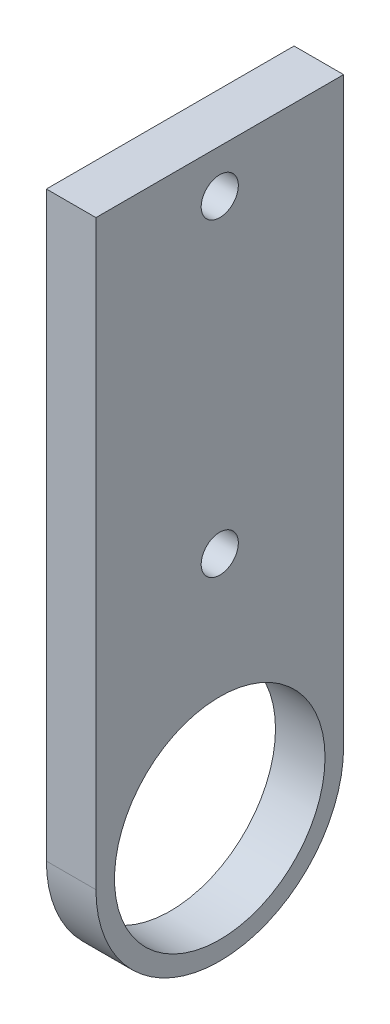
ISO-10303-21;
HEADER;
FILE_DESCRIPTION(('STEP AP214'),'2;1');
FILE_NAME('part.step','',(''),(''),'','','');
FILE_SCHEMA(('AUTOMOTIVE_DESIGN { 1 0 10303 214 1 1 1 1 }'));
ENDSEC;
DATA;
#1=APPLICATION_CONTEXT('core data for automotive mechanical design processes');
#2=APPLICATION_PROTOCOL_DEFINITION('international standard','automotive_design',2000,#1);
#3=PRODUCT_CONTEXT('',#1,'mechanical');
#4=PRODUCT('Part','Part','',(#3));
#5=PRODUCT_RELATED_PRODUCT_CATEGORY('part','',(#4));
#6=PRODUCT_DEFINITION_FORMATION('','',#4);
#7=PRODUCT_DEFINITION_CONTEXT('part definition',#1,'design');
#8=PRODUCT_DEFINITION('design','',#6,#7);
#9=PRODUCT_DEFINITION_SHAPE('','',#8);
#10=(LENGTH_UNIT() NAMED_UNIT(*) SI_UNIT(.MILLI.,.METRE.));
#11=(NAMED_UNIT(*) PLANE_ANGLE_UNIT() SI_UNIT($,.RADIAN.));
#12=(NAMED_UNIT(*) SI_UNIT($,.STERADIAN.) SOLID_ANGLE_UNIT());
#13=UNCERTAINTY_MEASURE_WITH_UNIT(LENGTH_MEASURE(1.E-05),#10,'distance_accuracy_value','');
#14=(GEOMETRIC_REPRESENTATION_CONTEXT(3) GLOBAL_UNCERTAINTY_ASSIGNED_CONTEXT((#13)) GLOBAL_UNIT_ASSIGNED_CONTEXT((#10,
#11,#12)) REPRESENTATION_CONTEXT('',''));
#15=CARTESIAN_POINT('',(0.,0.,0.));
#16=DIRECTION('',(0.,0.,1.));
#17=DIRECTION('',(1.,0.,0.));
#18=AXIS2_PLACEMENT_3D('',#15,#16,#17);
#19=CARTESIAN_POINT('',(4.,0.,10.));
#20=DIRECTION('',(0.,0.,-1.));
#21=DIRECTION('',(0.,1.,0.));
#22=AXIS2_PLACEMENT_3D('',#19,#20,#21);
#23=PLANE('',#22);
#24=DIRECTION('',(0.,-1.,0.));
#25=VECTOR('',#24,1.);
#26=CARTESIAN_POINT('',(0.,0.,10.));
#27=LINE('',#26,#25);
#28=CARTESIAN_POINT('',(0.,26.,10.));
#29=VERTEX_POINT('',#28);
#30=CARTESIAN_POINT('',(0.,-21.,9.99999999999999));
#31=VERTEX_POINT('',#30);
#32=EDGE_CURVE('E111',#29,#31,#27,.T.);
#33=ORIENTED_EDGE('',*,*,#32,.T.);
#34=DIRECTION('',(-1.,0.,0.));
#35=VECTOR('',#34,1.);
#36=CARTESIAN_POINT('',(4.,-21.,9.99999999999999));
#37=LINE('',#36,#35);
#38=CARTESIAN_POINT('',(4.,-21.,9.99999999999999));
#39=VERTEX_POINT('',#38);
#40=EDGE_CURVE('E11',#39,#31,#37,.T.);
#41=ORIENTED_EDGE('',*,*,#40,.F.);
#42=DIRECTION('',(0.,-1.,0.));
#43=VECTOR('',#42,1.);
#44=CARTESIAN_POINT('',(4.,0.,10.));
#45=LINE('',#44,#43);
#46=CARTESIAN_POINT('',(4.,26.,10.));
#47=VERTEX_POINT('',#46);
#48=EDGE_CURVE('E87',#47,#39,#45,.T.);
#49=ORIENTED_EDGE('',*,*,#48,.F.);
#50=DIRECTION('',(-1.,0.,0.));
#51=VECTOR('',#50,1.);
#52=CARTESIAN_POINT('',(4.,26.,10.));
#53=LINE('',#52,#51);
#54=EDGE_CURVE('E98',#47,#29,#53,.T.);
#55=ORIENTED_EDGE('',*,*,#54,.T.);
#56=EDGE_LOOP('',(#33,#41,#49,#55));
#57=FACE_BOUND('',#56,.T.);
#58=ADVANCED_FACE('F39',(#57),#23,.F.);
#59=CARTESIAN_POINT('',(4.,-21.,0.));
#60=DIRECTION('',(-1.,0.,0.));
#61=DIRECTION('',(0.,0.,1.));
#62=AXIS2_PLACEMENT_3D('',#59,#60,#61);
#63=CYLINDRICAL_SURFACE('',#62,10.);
#64=CARTESIAN_POINT('',(0.,-21.,0.));
#65=DIRECTION('',(1.,0.,0.));
#66=DIRECTION('',(0.,0.,-1.));
#67=AXIS2_PLACEMENT_3D('',#64,#65,#66);
#68=CIRCLE('',#67,10.);
#69=CARTESIAN_POINT('',(0.,-21.,-10.));
#70=VERTEX_POINT('',#69);
#71=EDGE_CURVE('E92',#31,#70,#68,.T.);
#72=ORIENTED_EDGE('',*,*,#71,.T.);
#73=DIRECTION('',(-1.,0.,0.));
#74=VECTOR('',#73,1.);
#75=CARTESIAN_POINT('',(4.,-21.,-10.));
#76=LINE('',#75,#74);
#77=CARTESIAN_POINT('',(4.,-21.,-10.));
#78=VERTEX_POINT('',#77);
#79=EDGE_CURVE('E48',#78,#70,#76,.T.);
#80=ORIENTED_EDGE('',*,*,#79,.F.);
#81=CARTESIAN_POINT('',(4.,-21.,0.));
#82=DIRECTION('',(1.,0.,0.));
#83=DIRECTION('',(0.,0.,-1.));
#84=AXIS2_PLACEMENT_3D('',#81,#82,#83);
#85=CIRCLE('',#84,10.);
#86=EDGE_CURVE('E82',#39,#78,#85,.T.);
#87=ORIENTED_EDGE('',*,*,#86,.F.);
#88=ORIENTED_EDGE('',*,*,#40,.T.);
#89=EDGE_LOOP('',(#72,#80,#87,#88));
#90=FACE_BOUND('',#89,.T.);
#91=ADVANCED_FACE('F91',(#90),#63,.T.);
#92=CARTESIAN_POINT('',(4.,0.,-10.));
#93=DIRECTION('',(0.,0.,-1.));
#94=DIRECTION('',(0.,1.,0.));
#95=AXIS2_PLACEMENT_3D('',#92,#93,#94);
#96=PLANE('',#95);
#97=DIRECTION('',(0.,-1.,0.));
#98=VECTOR('',#97,1.);
#99=CARTESIAN_POINT('',(0.,0.,-10.));
#100=LINE('',#99,#98);
#101=CARTESIAN_POINT('',(0.,26.,-10.));
#102=VERTEX_POINT('',#101);
#103=EDGE_CURVE('E115',#102,#70,#100,.T.);
#104=ORIENTED_EDGE('',*,*,#103,.F.);
#105=DIRECTION('',(-1.,0.,0.));
#106=VECTOR('',#105,1.);
#107=CARTESIAN_POINT('',(4.,26.,-10.));
#108=LINE('',#107,#106);
#109=CARTESIAN_POINT('',(4.,26.,-10.));
#110=VERTEX_POINT('',#109);
#111=EDGE_CURVE('E72',#110,#102,#108,.T.);
#112=ORIENTED_EDGE('',*,*,#111,.F.);
#113=DIRECTION('',(0.,-1.,0.));
#114=VECTOR('',#113,1.);
#115=CARTESIAN_POINT('',(4.,0.,-10.));
#116=LINE('',#115,#114);
#117=EDGE_CURVE('E85',#110,#78,#116,.T.);
#118=ORIENTED_EDGE('',*,*,#117,.T.);
#119=ORIENTED_EDGE('',*,*,#79,.T.);
#120=EDGE_LOOP('',(#104,#112,#118,#119));
#121=FACE_BOUND('',#120,.T.);
#122=ADVANCED_FACE('F96',(#121),#96,.T.);
#123=CARTESIAN_POINT('',(4.,22.5,0.));
#124=DIRECTION('',(-1.,0.,0.));
#125=DIRECTION('',(0.,0.,1.));
#126=AXIS2_PLACEMENT_3D('',#123,#124,#125);
#127=CYLINDRICAL_SURFACE('',#126,1.5);
#128=CARTESIAN_POINT('',(4.,22.5,0.));
#129=DIRECTION('',(1.,0.,0.));
#130=DIRECTION('',(0.,0.,-1.));
#131=AXIS2_PLACEMENT_3D('',#128,#129,#130);
#132=CIRCLE('',#131,1.5);
#133=CARTESIAN_POINT('',(4.,22.5,-1.5));
#134=VERTEX_POINT('',#133);
#135=EDGE_CURVE('E162',#134,#134,#132,.T.);
#136=ORIENTED_EDGE('',*,*,#135,.T.);
#137=EDGE_LOOP('',(#136));
#138=FACE_BOUND('',#137,.T.);
#139=CARTESIAN_POINT('',(0.,22.5,0.));
#140=DIRECTION('',(1.,0.,0.));
#141=DIRECTION('',(0.,0.,-1.));
#142=AXIS2_PLACEMENT_3D('',#139,#140,#141);
#143=CIRCLE('',#142,1.5);
#144=CARTESIAN_POINT('',(0.,22.5,-1.5));
#145=VERTEX_POINT('',#144);
#146=EDGE_CURVE('E108',#145,#145,#143,.T.);
#147=ORIENTED_EDGE('',*,*,#146,.F.);
#148=EDGE_LOOP('',(#147));
#149=FACE_BOUND('',#148,.T.);
#150=ADVANCED_FACE('F143',(#138,#149),#127,.F.);
#151=CARTESIAN_POINT('',(4.,-21.,0.));
#152=DIRECTION('',(-1.,0.,0.));
#153=DIRECTION('',(0.,0.,1.));
#154=AXIS2_PLACEMENT_3D('',#151,#152,#153);
#155=CYLINDRICAL_SURFACE('',#154,8.5);
#156=CARTESIAN_POINT('',(4.,-21.,0.));
#157=DIRECTION('',(1.,0.,0.));
#158=DIRECTION('',(0.,0.,-1.));
#159=AXIS2_PLACEMENT_3D('',#156,#157,#158);
#160=CIRCLE('',#159,8.5);
#161=CARTESIAN_POINT('',(4.,-21.,-8.50000000000001));
#162=VERTEX_POINT('',#161);
#163=EDGE_CURVE('E156',#162,#162,#160,.T.);
#164=ORIENTED_EDGE('',*,*,#163,.T.);
#165=EDGE_LOOP('',(#164));
#166=FACE_BOUND('',#165,.T.);
#167=CARTESIAN_POINT('',(0.,-21.,0.));
#168=DIRECTION('',(1.,0.,0.));
#169=DIRECTION('',(0.,0.,-1.));
#170=AXIS2_PLACEMENT_3D('',#167,#168,#169);
#171=CIRCLE('',#170,8.5);
#172=CARTESIAN_POINT('',(0.,-21.,-8.50000000000001));
#173=VERTEX_POINT('',#172);
#174=EDGE_CURVE('E105',#173,#173,#171,.T.);
#175=ORIENTED_EDGE('',*,*,#174,.F.);
#176=EDGE_LOOP('',(#175));
#177=FACE_BOUND('',#176,.T.);
#178=ADVANCED_FACE('F145',(#166,#177),#155,.F.);
#179=CARTESIAN_POINT('',(4.,-2.50000000000001,0.));
#180=DIRECTION('',(-1.,0.,0.));
#181=DIRECTION('',(0.,0.,1.));
#182=AXIS2_PLACEMENT_3D('',#179,#180,#181);
#183=CYLINDRICAL_SURFACE('',#182,1.5);
#184=CARTESIAN_POINT('',(4.,-2.50000000000001,0.));
#185=DIRECTION('',(1.,0.,0.));
#186=DIRECTION('',(0.,0.,-1.));
#187=AXIS2_PLACEMENT_3D('',#184,#185,#186);
#188=CIRCLE('',#187,1.5);
#189=CARTESIAN_POINT('',(4.,-2.50000000000001,-1.5));
#190=VERTEX_POINT('',#189);
#191=EDGE_CURVE('E118',#190,#190,#188,.T.);
#192=ORIENTED_EDGE('',*,*,#191,.T.);
#193=EDGE_LOOP('',(#192));
#194=FACE_BOUND('',#193,.T.);
#195=CARTESIAN_POINT('',(0.,-2.50000000000001,0.));
#196=DIRECTION('',(1.,0.,0.));
#197=DIRECTION('',(0.,0.,-1.));
#198=AXIS2_PLACEMENT_3D('',#195,#196,#197);
#199=CIRCLE('',#198,1.5);
#200=CARTESIAN_POINT('',(0.,-2.50000000000001,-1.5));
#201=VERTEX_POINT('',#200);
#202=EDGE_CURVE('E102',#201,#201,#199,.T.);
#203=ORIENTED_EDGE('',*,*,#202,.F.);
#204=EDGE_LOOP('',(#203));
#205=FACE_BOUND('',#204,.T.);
#206=ADVANCED_FACE('F41',(#194,#205),#183,.F.);
#207=CARTESIAN_POINT('',(4.,26.,0.));
#208=DIRECTION('',(0.,-1.,0.));
#209=DIRECTION('',(0.,0.,-1.));
#210=AXIS2_PLACEMENT_3D('',#207,#208,#209);
#211=PLANE('',#210);
#212=DIRECTION('',(0.,0.,1.));
#213=VECTOR('',#212,1.);
#214=CARTESIAN_POINT('',(0.,26.,0.));
#215=LINE('',#214,#213);
#216=EDGE_CURVE('E75',#102,#29,#215,.T.);
#217=ORIENTED_EDGE('',*,*,#216,.T.);
#218=ORIENTED_EDGE('',*,*,#54,.F.);
#219=DIRECTION('',(0.,0.,1.));
#220=VECTOR('',#219,1.);
#221=CARTESIAN_POINT('',(4.,26.,0.));
#222=LINE('',#221,#220);
#223=EDGE_CURVE('E56',#110,#47,#222,.T.);
#224=ORIENTED_EDGE('',*,*,#223,.F.);
#225=ORIENTED_EDGE('',*,*,#111,.T.);
#226=EDGE_LOOP('',(#217,#218,#224,#225));
#227=FACE_BOUND('',#226,.T.);
#228=ADVANCED_FACE('F130',(#227),#211,.F.);
#229=CARTESIAN_POINT('',(4.,0.,0.));
#230=DIRECTION('',(1.,0.,0.));
#231=DIRECTION('',(0.,0.,-1.));
#232=AXIS2_PLACEMENT_3D('',#229,#230,#231);
#233=PLANE('',#232);
#234=ORIENTED_EDGE('',*,*,#191,.F.);
#235=EDGE_LOOP('',(#234));
#236=FACE_BOUND('',#235,.T.);
#237=ORIENTED_EDGE('',*,*,#163,.F.);
#238=EDGE_LOOP('',(#237));
#239=FACE_BOUND('',#238,.T.);
#240=ORIENTED_EDGE('',*,*,#135,.F.);
#241=EDGE_LOOP('',(#240));
#242=FACE_BOUND('',#241,.T.);
#243=ORIENTED_EDGE('',*,*,#48,.T.);
#244=ORIENTED_EDGE('',*,*,#86,.T.);
#245=ORIENTED_EDGE('',*,*,#117,.F.);
#246=ORIENTED_EDGE('',*,*,#223,.T.);
#247=EDGE_LOOP('',(#243,#244,#245,#246));
#248=FACE_BOUND('',#247,.T.);
#249=ADVANCED_FACE('F83',(#236,#239,#242,#248),#233,.T.);
#250=CARTESIAN_POINT('',(0.,0.,0.));
#251=DIRECTION('',(1.,0.,0.));
#252=DIRECTION('',(0.,0.,-1.));
#253=AXIS2_PLACEMENT_3D('',#250,#251,#252);
#254=PLANE('',#253);
#255=ORIENTED_EDGE('',*,*,#202,.T.);
#256=EDGE_LOOP('',(#255));
#257=FACE_BOUND('',#256,.T.);
#258=ORIENTED_EDGE('',*,*,#174,.T.);
#259=EDGE_LOOP('',(#258));
#260=FACE_BOUND('',#259,.T.);
#261=ORIENTED_EDGE('',*,*,#146,.T.);
#262=EDGE_LOOP('',(#261));
#263=FACE_BOUND('',#262,.T.);
#264=ORIENTED_EDGE('',*,*,#32,.F.);
#265=ORIENTED_EDGE('',*,*,#216,.F.);
#266=ORIENTED_EDGE('',*,*,#103,.T.);
#267=ORIENTED_EDGE('',*,*,#71,.F.);
#268=EDGE_LOOP('',(#264,#265,#266,#267));
#269=FACE_BOUND('',#268,.T.);
#270=ADVANCED_FACE('F123',(#257,#260,#263,#269),#254,.F.);
#271=CLOSED_SHELL('',(#58,#91,#122,#150,#178,#206,#228,#249,#270));
#272=MANIFOLD_SOLID_BREP('B2',#271);
#273=ADVANCED_BREP_SHAPE_REPRESENTATION('',(#18,#272),#14);
#274=SHAPE_DEFINITION_REPRESENTATION(#9,#273);
ENDSEC;
END-ISO-10303-21;
